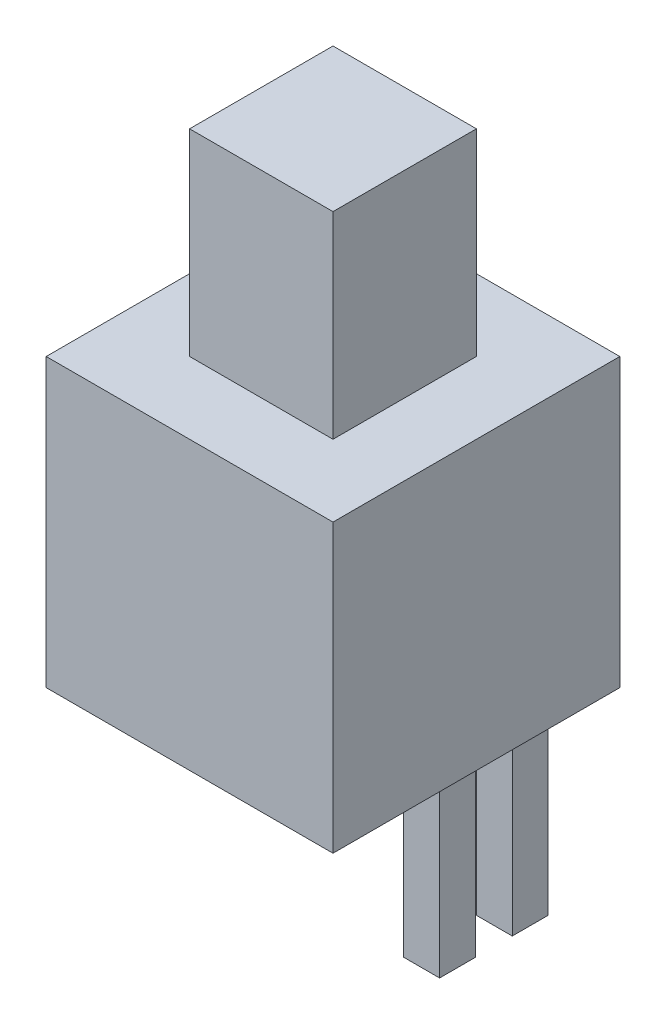
ISO-10303-21;
HEADER;
FILE_DESCRIPTION(('STEP AP214'),'2;1');
FILE_NAME('part.step','',(''),(''),'','','');
FILE_SCHEMA(('AUTOMOTIVE_DESIGN { 1 0 10303 214 1 1 1 1 }'));
ENDSEC;
DATA;
#1=APPLICATION_CONTEXT('core data for automotive mechanical design processes');
#2=APPLICATION_PROTOCOL_DEFINITION('international standard','automotive_design',2000,#1);
#3=PRODUCT_CONTEXT('',#1,'mechanical');
#4=PRODUCT('Part','Part','',(#3));
#5=PRODUCT_RELATED_PRODUCT_CATEGORY('part','',(#4));
#6=PRODUCT_DEFINITION_FORMATION('','',#4);
#7=PRODUCT_DEFINITION_CONTEXT('part definition',#1,'design');
#8=PRODUCT_DEFINITION('design','',#6,#7);
#9=PRODUCT_DEFINITION_SHAPE('','',#8);
#10=(LENGTH_UNIT() NAMED_UNIT(*) SI_UNIT(.MILLI.,.METRE.));
#11=(NAMED_UNIT(*) PLANE_ANGLE_UNIT() SI_UNIT($,.RADIAN.));
#12=(NAMED_UNIT(*) SI_UNIT($,.STERADIAN.) SOLID_ANGLE_UNIT());
#13=UNCERTAINTY_MEASURE_WITH_UNIT(LENGTH_MEASURE(1.E-05),#10,'distance_accuracy_value','');
#14=(GEOMETRIC_REPRESENTATION_CONTEXT(3) GLOBAL_UNCERTAINTY_ASSIGNED_CONTEXT((#13)) GLOBAL_UNIT_ASSIGNED_CONTEXT((#10,
#11,#12)) REPRESENTATION_CONTEXT('',''));
#15=CARTESIAN_POINT('',(0.,0.,0.));
#16=DIRECTION('',(0.,0.,1.));
#17=DIRECTION('',(1.,0.,0.));
#18=AXIS2_PLACEMENT_3D('',#15,#16,#17);
#19=CARTESIAN_POINT('',(0.,0.,0.));
#20=DIRECTION('',(0.,-1.,0.));
#21=DIRECTION('',(0.,0.,-1.));
#22=AXIS2_PLACEMENT_3D('',#19,#20,#21);
#23=PLANE('',#22);
#24=DIRECTION('',(0.,0.,-1.));
#25=VECTOR('',#24,1.);
#26=CARTESIAN_POINT('',(4.,0.,4.));
#27=LINE('',#26,#25);
#28=CARTESIAN_POINT('',(4.,0.,4.));
#29=VERTEX_POINT('',#28);
#30=CARTESIAN_POINT('',(4.,0.,-4.));
#31=VERTEX_POINT('',#30);
#32=EDGE_CURVE('E271',#29,#31,#27,.T.);
#33=ORIENTED_EDGE('',*,*,#32,.F.);
#34=DIRECTION('',(1.,0.,0.));
#35=VECTOR('',#34,1.);
#36=CARTESIAN_POINT('',(-4.,0.,4.));
#37=LINE('',#36,#35);
#38=CARTESIAN_POINT('',(-4.,0.,4.));
#39=VERTEX_POINT('',#38);
#40=EDGE_CURVE('E277',#39,#29,#37,.T.);
#41=ORIENTED_EDGE('',*,*,#40,.F.);
#42=DIRECTION('',(0.,0.,1.));
#43=VECTOR('',#42,1.);
#44=CARTESIAN_POINT('',(-4.,0.,4.));
#45=LINE('',#44,#43);
#46=CARTESIAN_POINT('',(-4.,0.,-4.));
#47=VERTEX_POINT('',#46);
#48=EDGE_CURVE('E293',#47,#39,#45,.T.);
#49=ORIENTED_EDGE('',*,*,#48,.F.);
#50=DIRECTION('',(-1.,0.,0.));
#51=VECTOR('',#50,1.);
#52=CARTESIAN_POINT('',(-4.,0.,-4.));
#53=LINE('',#52,#51);
#54=EDGE_CURVE('E290',#31,#47,#53,.T.);
#55=ORIENTED_EDGE('',*,*,#54,.F.);
#56=EDGE_LOOP('',(#33,#41,#49,#55));
#57=FACE_BOUND('',#56,.T.);
#58=DIRECTION('',(-1.,0.,0.));
#59=VECTOR('',#58,1.);
#60=CARTESIAN_POINT('',(2.,0.,-2.));
#61=LINE('',#60,#59);
#62=CARTESIAN_POINT('',(3.,0.,-2.));
#63=VERTEX_POINT('',#62);
#64=CARTESIAN_POINT('',(2.,0.,-2.));
#65=VERTEX_POINT('',#64);
#66=EDGE_CURVE('E187',#63,#65,#61,.T.);
#67=ORIENTED_EDGE('',*,*,#66,.F.);
#68=DIRECTION('',(0.,0.,1.));
#69=VECTOR('',#68,1.);
#70=CARTESIAN_POINT('',(3.,0.,-2.));
#71=LINE('',#70,#69);
#72=CARTESIAN_POINT('',(3.,0.,-3.));
#73=VERTEX_POINT('',#72);
#74=EDGE_CURVE('E182',#73,#63,#71,.T.);
#75=ORIENTED_EDGE('',*,*,#74,.F.);
#76=DIRECTION('',(1.,0.,0.));
#77=VECTOR('',#76,1.);
#78=CARTESIAN_POINT('',(2.,0.,-3.));
#79=LINE('',#78,#77);
#80=CARTESIAN_POINT('',(2.,0.,-3.));
#81=VERTEX_POINT('',#80);
#82=EDGE_CURVE('E197',#81,#73,#79,.T.);
#83=ORIENTED_EDGE('',*,*,#82,.F.);
#84=DIRECTION('',(0.,0.,-1.));
#85=VECTOR('',#84,1.);
#86=CARTESIAN_POINT('',(2.,0.,-2.));
#87=LINE('',#86,#85);
#88=EDGE_CURVE('E209',#65,#81,#87,.T.);
#89=ORIENTED_EDGE('',*,*,#88,.F.);
#90=EDGE_LOOP('',(#67,#75,#83,#89));
#91=FACE_BOUND('',#90,.T.);
#92=DIRECTION('',(-1.,0.,0.));
#93=VECTOR('',#92,1.);
#94=CARTESIAN_POINT('',(2.,0.,0.0266503201198753));
#95=LINE('',#94,#93);
#96=CARTESIAN_POINT('',(3.,0.,0.0266503201198753));
#97=VERTEX_POINT('',#96);
#98=CARTESIAN_POINT('',(2.,0.,0.0266503201198753));
#99=VERTEX_POINT('',#98);
#100=EDGE_CURVE('E525',#97,#99,#95,.T.);
#101=ORIENTED_EDGE('',*,*,#100,.F.);
#102=DIRECTION('',(0.,0.,1.));
#103=VECTOR('',#102,1.);
#104=CARTESIAN_POINT('',(3.,0.,0.0266503201198753));
#105=LINE('',#104,#103);
#106=CARTESIAN_POINT('',(3.,0.,-0.973349679880125));
#107=VERTEX_POINT('',#106);
#108=EDGE_CURVE('E179',#107,#97,#105,.T.);
#109=ORIENTED_EDGE('',*,*,#108,.F.);
#110=DIRECTION('',(1.,0.,0.));
#111=VECTOR('',#110,1.);
#112=CARTESIAN_POINT('',(2.,0.,-0.973349679880125));
#113=LINE('',#112,#111);
#114=CARTESIAN_POINT('',(2.,0.,-0.973349679880125));
#115=VERTEX_POINT('',#114);
#116=EDGE_CURVE('E175',#115,#107,#113,.T.);
#117=ORIENTED_EDGE('',*,*,#116,.F.);
#118=DIRECTION('',(0.,0.,-1.));
#119=VECTOR('',#118,1.);
#120=CARTESIAN_POINT('',(2.,0.,0.0266503201198753));
#121=LINE('',#120,#119);
#122=EDGE_CURVE('E521',#99,#115,#121,.T.);
#123=ORIENTED_EDGE('',*,*,#122,.F.);
#124=EDGE_LOOP('',(#101,#109,#117,#123));
#125=FACE_BOUND('',#124,.T.);
#126=ADVANCED_FACE('F39',(#57,#91,#125),#23,.T.);
#127=CARTESIAN_POINT('',(0.,8.,0.));
#128=DIRECTION('',(0.,-1.,0.));
#129=DIRECTION('',(0.,0.,-1.));
#130=AXIS2_PLACEMENT_3D('',#127,#128,#129);
#131=PLANE('',#130);
#132=DIRECTION('',(0.,0.,-1.));
#133=VECTOR('',#132,1.);
#134=CARTESIAN_POINT('',(4.,8.,4.));
#135=LINE('',#134,#133);
#136=CARTESIAN_POINT('',(4.,8.,4.));
#137=VERTEX_POINT('',#136);
#138=CARTESIAN_POINT('',(4.,8.,-4.));
#139=VERTEX_POINT('',#138);
#140=EDGE_CURVE('E272',#137,#139,#135,.T.);
#141=ORIENTED_EDGE('',*,*,#140,.T.);
#142=DIRECTION('',(-1.,0.,0.));
#143=VECTOR('',#142,1.);
#144=CARTESIAN_POINT('',(-4.,8.,-4.));
#145=LINE('',#144,#143);
#146=CARTESIAN_POINT('',(-4.,8.,-4.));
#147=VERTEX_POINT('',#146);
#148=EDGE_CURVE('E276',#139,#147,#145,.T.);
#149=ORIENTED_EDGE('',*,*,#148,.T.);
#150=DIRECTION('',(0.,0.,1.));
#151=VECTOR('',#150,1.);
#152=CARTESIAN_POINT('',(-4.,8.,4.));
#153=LINE('',#152,#151);
#154=CARTESIAN_POINT('',(-4.,8.,4.));
#155=VERTEX_POINT('',#154);
#156=EDGE_CURVE('E280',#147,#155,#153,.T.);
#157=ORIENTED_EDGE('',*,*,#156,.T.);
#158=DIRECTION('',(1.,0.,0.));
#159=VECTOR('',#158,1.);
#160=CARTESIAN_POINT('',(-4.,8.,4.));
#161=LINE('',#160,#159);
#162=EDGE_CURVE('E283',#155,#137,#161,.T.);
#163=ORIENTED_EDGE('',*,*,#162,.T.);
#164=EDGE_LOOP('',(#141,#149,#157,#163));
#165=FACE_BOUND('',#164,.T.);
#166=DIRECTION('',(0.,0.,-1.));
#167=VECTOR('',#166,1.);
#168=CARTESIAN_POINT('',(2.,8.,2.));
#169=LINE('',#168,#167);
#170=CARTESIAN_POINT('',(2.,8.,2.));
#171=VERTEX_POINT('',#170);
#172=CARTESIAN_POINT('',(2.,8.,-2.));
#173=VERTEX_POINT('',#172);
#174=EDGE_CURVE('E226',#171,#173,#169,.T.);
#175=ORIENTED_EDGE('',*,*,#174,.F.);
#176=DIRECTION('',(1.,0.,0.));
#177=VECTOR('',#176,1.);
#178=CARTESIAN_POINT('',(-2.,8.,2.));
#179=LINE('',#178,#177);
#180=CARTESIAN_POINT('',(-2.,8.,2.));
#181=VERTEX_POINT('',#180);
#182=EDGE_CURVE('E232',#181,#171,#179,.T.);
#183=ORIENTED_EDGE('',*,*,#182,.F.);
#184=DIRECTION('',(0.,0.,1.));
#185=VECTOR('',#184,1.);
#186=CARTESIAN_POINT('',(-2.,8.,2.));
#187=LINE('',#186,#185);
#188=CARTESIAN_POINT('',(-2.,8.,-2.));
#189=VERTEX_POINT('',#188);
#190=EDGE_CURVE('E249',#189,#181,#187,.T.);
#191=ORIENTED_EDGE('',*,*,#190,.F.);
#192=DIRECTION('',(-1.,0.,0.));
#193=VECTOR('',#192,1.);
#194=CARTESIAN_POINT('',(-2.,8.,-2.));
#195=LINE('',#194,#193);
#196=EDGE_CURVE('E245',#173,#189,#195,.T.);
#197=ORIENTED_EDGE('',*,*,#196,.F.);
#198=EDGE_LOOP('',(#175,#183,#191,#197));
#199=FACE_BOUND('',#198,.T.);
#200=ADVANCED_FACE('F325',(#165,#199),#131,.F.);
#201=CARTESIAN_POINT('',(4.,8.,4.));
#202=DIRECTION('',(-1.,0.,0.));
#203=DIRECTION('',(0.,0.,1.));
#204=AXIS2_PLACEMENT_3D('',#201,#202,#203);
#205=PLANE('',#204);
#206=ORIENTED_EDGE('',*,*,#32,.T.);
#207=DIRECTION('',(0.,-1.,0.));
#208=VECTOR('',#207,1.);
#209=CARTESIAN_POINT('',(4.,8.,-4.));
#210=LINE('',#209,#208);
#211=EDGE_CURVE('E11',#139,#31,#210,.T.);
#212=ORIENTED_EDGE('',*,*,#211,.F.);
#213=ORIENTED_EDGE('',*,*,#140,.F.);
#214=DIRECTION('',(0.,-1.,0.));
#215=VECTOR('',#214,1.);
#216=CARTESIAN_POINT('',(4.,8.,4.));
#217=LINE('',#216,#215);
#218=EDGE_CURVE('E286',#137,#29,#217,.T.);
#219=ORIENTED_EDGE('',*,*,#218,.T.);
#220=EDGE_LOOP('',(#206,#212,#213,#219));
#221=FACE_BOUND('',#220,.T.);
#222=ADVANCED_FACE('F41',(#221),#205,.F.);
#223=CARTESIAN_POINT('',(-4.,8.,-4.));
#224=DIRECTION('',(0.,0.,1.));
#225=DIRECTION('',(1.,0.,0.));
#226=AXIS2_PLACEMENT_3D('',#223,#224,#225);
#227=PLANE('',#226);
#228=ORIENTED_EDGE('',*,*,#54,.T.);
#229=DIRECTION('',(0.,-1.,0.));
#230=VECTOR('',#229,1.);
#231=CARTESIAN_POINT('',(-4.,8.,-4.));
#232=LINE('',#231,#230);
#233=EDGE_CURVE('E48',#147,#47,#232,.T.);
#234=ORIENTED_EDGE('',*,*,#233,.F.);
#235=ORIENTED_EDGE('',*,*,#148,.F.);
#236=ORIENTED_EDGE('',*,*,#211,.T.);
#237=EDGE_LOOP('',(#228,#234,#235,#236));
#238=FACE_BOUND('',#237,.T.);
#239=ADVANCED_FACE('F327',(#238),#227,.F.);
#240=CARTESIAN_POINT('',(-4.,8.,4.));
#241=DIRECTION('',(1.,0.,0.));
#242=DIRECTION('',(0.,0.,-1.));
#243=AXIS2_PLACEMENT_3D('',#240,#241,#242);
#244=PLANE('',#243);
#245=ORIENTED_EDGE('',*,*,#48,.T.);
#246=DIRECTION('',(0.,-1.,0.));
#247=VECTOR('',#246,1.);
#248=CARTESIAN_POINT('',(-4.,8.,4.));
#249=LINE('',#248,#247);
#250=EDGE_CURVE('E301',#155,#39,#249,.T.);
#251=ORIENTED_EDGE('',*,*,#250,.F.);
#252=ORIENTED_EDGE('',*,*,#156,.F.);
#253=ORIENTED_EDGE('',*,*,#233,.T.);
#254=EDGE_LOOP('',(#245,#251,#252,#253));
#255=FACE_BOUND('',#254,.T.);
#256=ADVANCED_FACE('F310',(#255),#244,.F.);
#257=CARTESIAN_POINT('',(-4.,8.,4.));
#258=DIRECTION('',(0.,0.,-1.));
#259=DIRECTION('',(-1.,0.,0.));
#260=AXIS2_PLACEMENT_3D('',#257,#258,#259);
#261=PLANE('',#260);
#262=ORIENTED_EDGE('',*,*,#40,.T.);
#263=ORIENTED_EDGE('',*,*,#218,.F.);
#264=ORIENTED_EDGE('',*,*,#162,.F.);
#265=ORIENTED_EDGE('',*,*,#250,.T.);
#266=EDGE_LOOP('',(#262,#263,#264,#265));
#267=FACE_BOUND('',#266,.T.);
#268=ADVANCED_FACE('F319',(#267),#261,.F.);
#269=CARTESIAN_POINT('',(2.,13.5,2.));
#270=DIRECTION('',(-1.,0.,0.));
#271=DIRECTION('',(0.,0.,1.));
#272=AXIS2_PLACEMENT_3D('',#269,#270,#271);
#273=PLANE('',#272);
#274=ORIENTED_EDGE('',*,*,#174,.T.);
#275=DIRECTION('',(0.,-1.,0.));
#276=VECTOR('',#275,1.);
#277=CARTESIAN_POINT('',(2.,13.5,-2.));
#278=LINE('',#277,#276);
#279=CARTESIAN_POINT('',(2.,13.5,-2.));
#280=VERTEX_POINT('',#279);
#281=EDGE_CURVE('E267',#280,#173,#278,.T.);
#282=ORIENTED_EDGE('',*,*,#281,.F.);
#283=DIRECTION('',(0.,0.,-1.));
#284=VECTOR('',#283,1.);
#285=CARTESIAN_POINT('',(2.,13.5,2.));
#286=LINE('',#285,#284);
#287=CARTESIAN_POINT('',(2.,13.5,2.));
#288=VERTEX_POINT('',#287);
#289=EDGE_CURVE('E227',#288,#280,#286,.T.);
#290=ORIENTED_EDGE('',*,*,#289,.F.);
#291=DIRECTION('',(0.,-1.,0.));
#292=VECTOR('',#291,1.);
#293=CARTESIAN_POINT('',(2.,13.5,2.));
#294=LINE('',#293,#292);
#295=EDGE_CURVE('E241',#288,#171,#294,.T.);
#296=ORIENTED_EDGE('',*,*,#295,.T.);
#297=EDGE_LOOP('',(#274,#282,#290,#296));
#298=FACE_BOUND('',#297,.T.);
#299=ADVANCED_FACE('F345',(#298),#273,.F.);
#300=CARTESIAN_POINT('',(-2.,13.5,-2.));
#301=DIRECTION('',(0.,0.,1.));
#302=DIRECTION('',(1.,0.,0.));
#303=AXIS2_PLACEMENT_3D('',#300,#301,#302);
#304=PLANE('',#303);
#305=ORIENTED_EDGE('',*,*,#196,.T.);
#306=DIRECTION('',(0.,-1.,0.));
#307=VECTOR('',#306,1.);
#308=CARTESIAN_POINT('',(-2.,13.5,-2.));
#309=LINE('',#308,#307);
#310=CARTESIAN_POINT('',(-2.,13.5,-2.));
#311=VERTEX_POINT('',#310);
#312=EDGE_CURVE('E263',#311,#189,#309,.T.);
#313=ORIENTED_EDGE('',*,*,#312,.F.);
#314=DIRECTION('',(-1.,0.,0.));
#315=VECTOR('',#314,1.);
#316=CARTESIAN_POINT('',(-2.,13.5,-2.));
#317=LINE('',#316,#315);
#318=EDGE_CURVE('E231',#280,#311,#317,.T.);
#319=ORIENTED_EDGE('',*,*,#318,.F.);
#320=ORIENTED_EDGE('',*,*,#281,.T.);
#321=EDGE_LOOP('',(#305,#313,#319,#320));
#322=FACE_BOUND('',#321,.T.);
#323=ADVANCED_FACE('F349',(#322),#304,.F.);
#324=CARTESIAN_POINT('',(-2.,13.5,2.));
#325=DIRECTION('',(1.,0.,0.));
#326=DIRECTION('',(0.,0.,-1.));
#327=AXIS2_PLACEMENT_3D('',#324,#325,#326);
#328=PLANE('',#327);
#329=ORIENTED_EDGE('',*,*,#190,.T.);
#330=DIRECTION('',(0.,-1.,0.));
#331=VECTOR('',#330,1.);
#332=CARTESIAN_POINT('',(-2.,13.5,2.));
#333=LINE('',#332,#331);
#334=CARTESIAN_POINT('',(-2.,13.5,2.));
#335=VERTEX_POINT('',#334);
#336=EDGE_CURVE('E259',#335,#181,#333,.T.);
#337=ORIENTED_EDGE('',*,*,#336,.F.);
#338=DIRECTION('',(0.,0.,1.));
#339=VECTOR('',#338,1.);
#340=CARTESIAN_POINT('',(-2.,13.5,2.));
#341=LINE('',#340,#339);
#342=EDGE_CURVE('E235',#311,#335,#341,.T.);
#343=ORIENTED_EDGE('',*,*,#342,.F.);
#344=ORIENTED_EDGE('',*,*,#312,.T.);
#345=EDGE_LOOP('',(#329,#337,#343,#344));
#346=FACE_BOUND('',#345,.T.);
#347=ADVANCED_FACE('F354',(#346),#328,.F.);
#348=CARTESIAN_POINT('',(-2.,13.5,2.));
#349=DIRECTION('',(0.,0.,-1.));
#350=DIRECTION('',(-1.,0.,0.));
#351=AXIS2_PLACEMENT_3D('',#348,#349,#350);
#352=PLANE('',#351);
#353=ORIENTED_EDGE('',*,*,#182,.T.);
#354=ORIENTED_EDGE('',*,*,#295,.F.);
#355=DIRECTION('',(1.,0.,0.));
#356=VECTOR('',#355,1.);
#357=CARTESIAN_POINT('',(-2.,13.5,2.));
#358=LINE('',#357,#356);
#359=EDGE_CURVE('E238',#335,#288,#358,.T.);
#360=ORIENTED_EDGE('',*,*,#359,.F.);
#361=ORIENTED_EDGE('',*,*,#336,.T.);
#362=EDGE_LOOP('',(#353,#354,#360,#361));
#363=FACE_BOUND('',#362,.T.);
#364=ADVANCED_FACE('F360',(#363),#352,.F.);
#365=CARTESIAN_POINT('',(0.,13.5,0.));
#366=DIRECTION('',(0.,-1.,0.));
#367=DIRECTION('',(0.,0.,-1.));
#368=AXIS2_PLACEMENT_3D('',#365,#366,#367);
#369=PLANE('',#368);
#370=ORIENTED_EDGE('',*,*,#289,.T.);
#371=ORIENTED_EDGE('',*,*,#318,.T.);
#372=ORIENTED_EDGE('',*,*,#342,.T.);
#373=ORIENTED_EDGE('',*,*,#359,.T.);
#374=EDGE_LOOP('',(#370,#371,#372,#373));
#375=FACE_BOUND('',#374,.T.);
#376=ADVANCED_FACE('F364',(#375),#369,.F.);
#377=CARTESIAN_POINT('',(3.,-5.5,-2.));
#378=DIRECTION('',(-1.,0.,0.));
#379=DIRECTION('',(0.,0.,1.));
#380=AXIS2_PLACEMENT_3D('',#377,#378,#379);
#381=PLANE('',#380);
#382=ORIENTED_EDGE('',*,*,#74,.T.);
#383=DIRECTION('',(0.,1.,0.));
#384=VECTOR('',#383,1.);
#385=CARTESIAN_POINT('',(3.,-5.5,-2.));
#386=LINE('',#385,#384);
#387=CARTESIAN_POINT('',(3.,-5.5,-2.));
#388=VERTEX_POINT('',#387);
#389=EDGE_CURVE('E223',#388,#63,#386,.T.);
#390=ORIENTED_EDGE('',*,*,#389,.F.);
#391=DIRECTION('',(0.,0.,1.));
#392=VECTOR('',#391,1.);
#393=CARTESIAN_POINT('',(3.,-5.5,-2.));
#394=LINE('',#393,#392);
#395=CARTESIAN_POINT('',(3.,-5.5,-3.));
#396=VERTEX_POINT('',#395);
#397=EDGE_CURVE('E192',#396,#388,#394,.T.);
#398=ORIENTED_EDGE('',*,*,#397,.F.);
#399=DIRECTION('',(0.,1.,0.));
#400=VECTOR('',#399,1.);
#401=CARTESIAN_POINT('',(3.,-5.5,-3.));
#402=LINE('',#401,#400);
#403=EDGE_CURVE('E205',#396,#73,#402,.T.);
#404=ORIENTED_EDGE('',*,*,#403,.T.);
#405=EDGE_LOOP('',(#382,#390,#398,#404));
#406=FACE_BOUND('',#405,.T.);
#407=ADVANCED_FACE('F368',(#406),#381,.F.);
#408=CARTESIAN_POINT('',(2.,-5.5,-2.));
#409=DIRECTION('',(0.,0.,-1.));
#410=DIRECTION('',(-1.,0.,0.));
#411=AXIS2_PLACEMENT_3D('',#408,#409,#410);
#412=PLANE('',#411);
#413=ORIENTED_EDGE('',*,*,#66,.T.);
#414=DIRECTION('',(0.,1.,0.));
#415=VECTOR('',#414,1.);
#416=CARTESIAN_POINT('',(2.,-5.5,-2.));
#417=LINE('',#416,#415);
#418=CARTESIAN_POINT('',(2.,-5.5,-2.));
#419=VERTEX_POINT('',#418);
#420=EDGE_CURVE('E219',#419,#65,#417,.T.);
#421=ORIENTED_EDGE('',*,*,#420,.F.);
#422=DIRECTION('',(-1.,0.,0.));
#423=VECTOR('',#422,1.);
#424=CARTESIAN_POINT('',(2.,-5.5,-2.));
#425=LINE('',#424,#423);
#426=EDGE_CURVE('E196',#388,#419,#425,.T.);
#427=ORIENTED_EDGE('',*,*,#426,.F.);
#428=ORIENTED_EDGE('',*,*,#389,.T.);
#429=EDGE_LOOP('',(#413,#421,#427,#428));
#430=FACE_BOUND('',#429,.T.);
#431=ADVANCED_FACE('F372',(#430),#412,.F.);
#432=CARTESIAN_POINT('',(2.,-5.5,-2.));
#433=DIRECTION('',(1.,0.,0.));
#434=DIRECTION('',(0.,0.,-1.));
#435=AXIS2_PLACEMENT_3D('',#432,#433,#434);
#436=PLANE('',#435);
#437=ORIENTED_EDGE('',*,*,#88,.T.);
#438=DIRECTION('',(0.,1.,0.));
#439=VECTOR('',#438,1.);
#440=CARTESIAN_POINT('',(2.,-5.5,-3.));
#441=LINE('',#440,#439);
#442=CARTESIAN_POINT('',(2.,-5.5,-3.));
#443=VERTEX_POINT('',#442);
#444=EDGE_CURVE('E63',#443,#81,#441,.T.);
#445=ORIENTED_EDGE('',*,*,#444,.F.);
#446=DIRECTION('',(0.,0.,-1.));
#447=VECTOR('',#446,1.);
#448=CARTESIAN_POINT('',(2.,-5.5,-2.));
#449=LINE('',#448,#447);
#450=EDGE_CURVE('E200',#419,#443,#449,.T.);
#451=ORIENTED_EDGE('',*,*,#450,.F.);
#452=ORIENTED_EDGE('',*,*,#420,.T.);
#453=EDGE_LOOP('',(#437,#445,#451,#452));
#454=FACE_BOUND('',#453,.T.);
#455=ADVANCED_FACE('F376',(#454),#436,.F.);
#456=CARTESIAN_POINT('',(2.,-5.5,-3.));
#457=DIRECTION('',(0.,0.,1.));
#458=DIRECTION('',(1.,0.,0.));
#459=AXIS2_PLACEMENT_3D('',#456,#457,#458);
#460=PLANE('',#459);
#461=ORIENTED_EDGE('',*,*,#82,.T.);
#462=ORIENTED_EDGE('',*,*,#403,.F.);
#463=DIRECTION('',(1.,0.,0.));
#464=VECTOR('',#463,1.);
#465=CARTESIAN_POINT('',(2.,-5.5,-3.));
#466=LINE('',#465,#464);
#467=EDGE_CURVE('E203',#443,#396,#466,.T.);
#468=ORIENTED_EDGE('',*,*,#467,.F.);
#469=ORIENTED_EDGE('',*,*,#444,.T.);
#470=EDGE_LOOP('',(#461,#462,#468,#469));
#471=FACE_BOUND('',#470,.T.);
#472=ADVANCED_FACE('F380',(#471),#460,.F.);
#473=CARTESIAN_POINT('',(0.,-5.5,0.));
#474=DIRECTION('',(0.,-1.,0.));
#475=DIRECTION('',(0.,0.,-1.));
#476=AXIS2_PLACEMENT_3D('',#473,#474,#475);
#477=PLANE('',#476);
#478=ORIENTED_EDGE('',*,*,#397,.T.);
#479=ORIENTED_EDGE('',*,*,#426,.T.);
#480=ORIENTED_EDGE('',*,*,#450,.T.);
#481=ORIENTED_EDGE('',*,*,#467,.T.);
#482=EDGE_LOOP('',(#478,#479,#480,#481));
#483=FACE_BOUND('',#482,.T.);
#484=ADVANCED_FACE('F384',(#483),#477,.T.);
#485=CARTESIAN_POINT('',(3.,-5.5,0.0266503201198753));
#486=DIRECTION('',(-1.,0.,0.));
#487=DIRECTION('',(0.,0.,1.));
#488=AXIS2_PLACEMENT_3D('',#485,#486,#487);
#489=PLANE('',#488);
#490=ORIENTED_EDGE('',*,*,#108,.T.);
#491=DIRECTION('',(0.,1.,0.));
#492=VECTOR('',#491,1.);
#493=CARTESIAN_POINT('',(3.,-5.5,0.0266503201198753));
#494=LINE('',#493,#492);
#495=CARTESIAN_POINT('',(3.,-5.5,0.0266503201198753));
#496=VERTEX_POINT('',#495);
#497=EDGE_CURVE('E158',#496,#97,#494,.T.);
#498=ORIENTED_EDGE('',*,*,#497,.F.);
#499=DIRECTION('',(0.,0.,1.));
#500=VECTOR('',#499,1.);
#501=CARTESIAN_POINT('',(3.,-5.5,0.0266503201198753));
#502=LINE('',#501,#500);
#503=CARTESIAN_POINT('',(3.,-5.5,-0.973349679880125));
#504=VERTEX_POINT('',#503);
#505=EDGE_CURVE('E166',#504,#496,#502,.T.);
#506=ORIENTED_EDGE('',*,*,#505,.F.);
#507=DIRECTION('',(0.,1.,0.));
#508=VECTOR('',#507,1.);
#509=CARTESIAN_POINT('',(3.,-5.5,-0.973349679880125));
#510=LINE('',#509,#508);
#511=EDGE_CURVE('E517',#504,#107,#510,.T.);
#512=ORIENTED_EDGE('',*,*,#511,.T.);
#513=EDGE_LOOP('',(#490,#498,#506,#512));
#514=FACE_BOUND('',#513,.T.);
#515=ADVANCED_FACE('F177',(#514),#489,.F.);
#516=CARTESIAN_POINT('',(2.,-5.5,0.0266503201198753));
#517=DIRECTION('',(0.,0.,-1.));
#518=DIRECTION('',(-1.,0.,0.));
#519=AXIS2_PLACEMENT_3D('',#516,#517,#518);
#520=PLANE('',#519);
#521=ORIENTED_EDGE('',*,*,#100,.T.);
#522=DIRECTION('',(0.,1.,0.));
#523=VECTOR('',#522,1.);
#524=CARTESIAN_POINT('',(2.,-5.5,0.0266503201198753));
#525=LINE('',#524,#523);
#526=CARTESIAN_POINT('',(2.,-5.5,0.0266503201198753));
#527=VERTEX_POINT('',#526);
#528=EDGE_CURVE('E161',#527,#99,#525,.T.);
#529=ORIENTED_EDGE('',*,*,#528,.F.);
#530=DIRECTION('',(-1.,0.,0.));
#531=VECTOR('',#530,1.);
#532=CARTESIAN_POINT('',(2.,-5.5,0.0266503201198753));
#533=LINE('',#532,#531);
#534=EDGE_CURVE('E154',#496,#527,#533,.T.);
#535=ORIENTED_EDGE('',*,*,#534,.F.);
#536=ORIENTED_EDGE('',*,*,#497,.T.);
#537=EDGE_LOOP('',(#521,#529,#535,#536));
#538=FACE_BOUND('',#537,.T.);
#539=ADVANCED_FACE('F156',(#538),#520,.F.);
#540=CARTESIAN_POINT('',(2.,-5.5,0.0266503201198753));
#541=DIRECTION('',(1.,0.,0.));
#542=DIRECTION('',(0.,0.,-1.));
#543=AXIS2_PLACEMENT_3D('',#540,#541,#542);
#544=PLANE('',#543);
#545=ORIENTED_EDGE('',*,*,#122,.T.);
#546=DIRECTION('',(0.,1.,0.));
#547=VECTOR('',#546,1.);
#548=CARTESIAN_POINT('',(2.,-5.5,-0.973349679880125));
#549=LINE('',#548,#547);
#550=CARTESIAN_POINT('',(2.,-5.5,-0.973349679880125));
#551=VERTEX_POINT('',#550);
#552=EDGE_CURVE('E55',#551,#115,#549,.T.);
#553=ORIENTED_EDGE('',*,*,#552,.F.);
#554=DIRECTION('',(0.,0.,-1.));
#555=VECTOR('',#554,1.);
#556=CARTESIAN_POINT('',(2.,-5.5,0.0266503201198753));
#557=LINE('',#556,#555);
#558=EDGE_CURVE('E165',#527,#551,#557,.T.);
#559=ORIENTED_EDGE('',*,*,#558,.F.);
#560=ORIENTED_EDGE('',*,*,#528,.T.);
#561=EDGE_LOOP('',(#545,#553,#559,#560));
#562=FACE_BOUND('',#561,.T.);
#563=ADVANCED_FACE('F392',(#562),#544,.F.);
#564=CARTESIAN_POINT('',(2.,-5.5,-0.973349679880125));
#565=DIRECTION('',(0.,0.,1.));
#566=DIRECTION('',(1.,0.,0.));
#567=AXIS2_PLACEMENT_3D('',#564,#565,#566);
#568=PLANE('',#567);
#569=ORIENTED_EDGE('',*,*,#116,.T.);
#570=ORIENTED_EDGE('',*,*,#511,.F.);
#571=DIRECTION('',(1.,0.,0.));
#572=VECTOR('',#571,1.);
#573=CARTESIAN_POINT('',(2.,-5.5,-0.973349679880125));
#574=LINE('',#573,#572);
#575=EDGE_CURVE('E170',#551,#504,#574,.T.);
#576=ORIENTED_EDGE('',*,*,#575,.F.);
#577=ORIENTED_EDGE('',*,*,#552,.T.);
#578=EDGE_LOOP('',(#569,#570,#576,#577));
#579=FACE_BOUND('',#578,.T.);
#580=ADVANCED_FACE('F395',(#579),#568,.F.);
#581=CARTESIAN_POINT('',(0.,-5.5,0.));
#582=DIRECTION('',(0.,-1.,0.));
#583=DIRECTION('',(0.,0.,-1.));
#584=AXIS2_PLACEMENT_3D('',#581,#582,#583);
#585=PLANE('',#584);
#586=ORIENTED_EDGE('',*,*,#505,.T.);
#587=ORIENTED_EDGE('',*,*,#534,.T.);
#588=ORIENTED_EDGE('',*,*,#558,.T.);
#589=ORIENTED_EDGE('',*,*,#575,.T.);
#590=EDGE_LOOP('',(#586,#587,#588,#589));
#591=FACE_BOUND('',#590,.T.);
#592=ADVANCED_FACE('F169',(#591),#585,.T.);
#593=CLOSED_SHELL('',(#126,#200,#222,#239,#256,#268,#299,#323,#347,#364,#376,#407,#431,#455,
#472,#484,#515,#539,#563,#580,#592));
#594=MANIFOLD_SOLID_BREP('B2',#593);
#595=ADVANCED_BREP_SHAPE_REPRESENTATION('',(#18,#594),#14);
#596=SHAPE_DEFINITION_REPRESENTATION(#9,#595);
ENDSEC;
END-ISO-10303-21;
